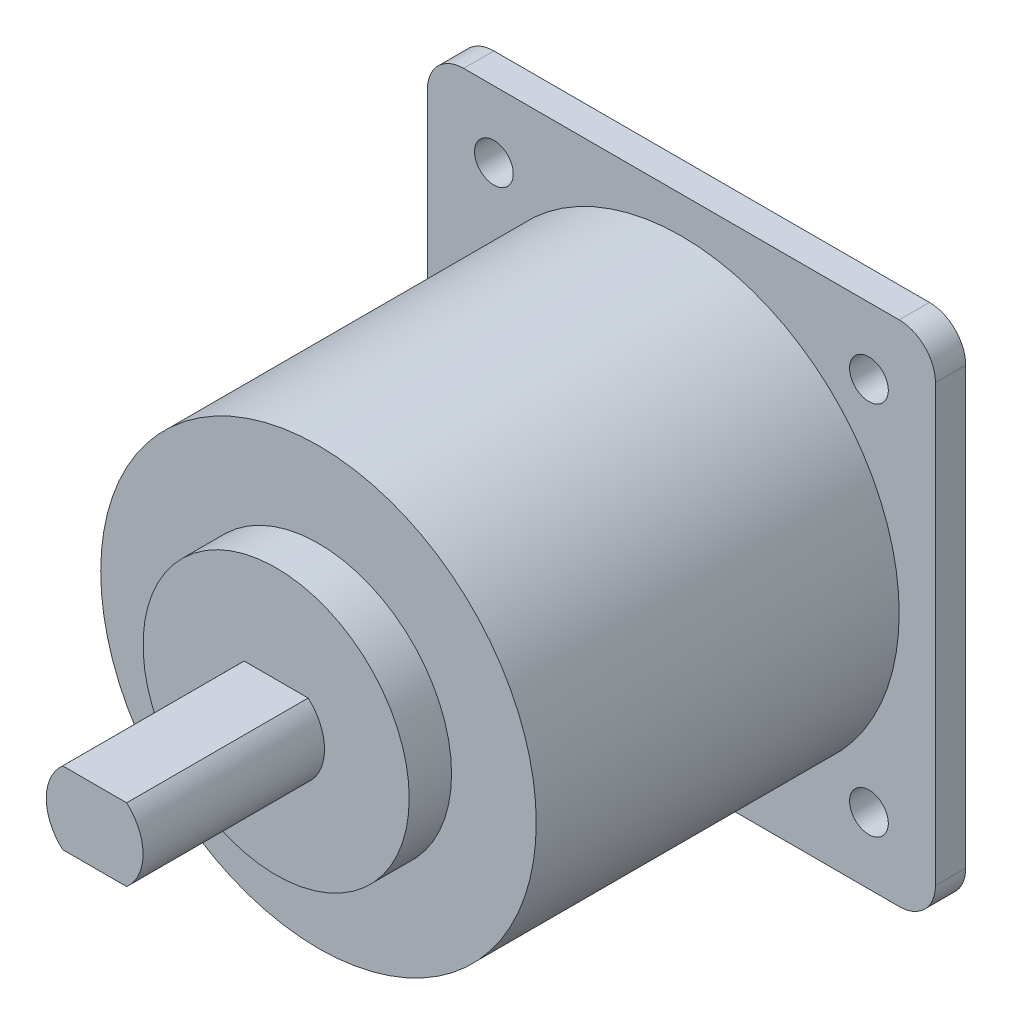
ISO-10303-21;
HEADER;
FILE_DESCRIPTION(('STEP AP214'),'2;1');
FILE_NAME('part.step','',(''),(''),'','','');
FILE_SCHEMA(('AUTOMOTIVE_DESIGN { 1 0 10303 214 1 1 1 1 }'));
ENDSEC;
DATA;
#1=APPLICATION_CONTEXT('core data for automotive mechanical design processes');
#2=APPLICATION_PROTOCOL_DEFINITION('international standard','automotive_design',2000,#1);
#3=PRODUCT_CONTEXT('',#1,'mechanical');
#4=PRODUCT('Part','Part','',(#3));
#5=PRODUCT_RELATED_PRODUCT_CATEGORY('part','',(#4));
#6=PRODUCT_DEFINITION_FORMATION('','',#4);
#7=PRODUCT_DEFINITION_CONTEXT('part definition',#1,'design');
#8=PRODUCT_DEFINITION('design','',#6,#7);
#9=PRODUCT_DEFINITION_SHAPE('','',#8);
#10=(LENGTH_UNIT() NAMED_UNIT(*) SI_UNIT(.MILLI.,.METRE.));
#11=(NAMED_UNIT(*) PLANE_ANGLE_UNIT() SI_UNIT($,.RADIAN.));
#12=(NAMED_UNIT(*) SI_UNIT($,.STERADIAN.) SOLID_ANGLE_UNIT());
#13=UNCERTAINTY_MEASURE_WITH_UNIT(LENGTH_MEASURE(1.E-05),#10,'distance_accuracy_value','');
#14=(GEOMETRIC_REPRESENTATION_CONTEXT(3) GLOBAL_UNCERTAINTY_ASSIGNED_CONTEXT((#13)) GLOBAL_UNIT_ASSIGNED_CONTEXT((#10,
#11,#12)) REPRESENTATION_CONTEXT('',''));
#15=CARTESIAN_POINT('',(0.,0.,0.));
#16=DIRECTION('',(0.,0.,1.));
#17=DIRECTION('',(1.,0.,0.));
#18=AXIS2_PLACEMENT_3D('',#15,#16,#17);
#19=CARTESIAN_POINT('',(0.,0.,32.5));
#20=DIRECTION('',(0.,0.,-1.));
#21=DIRECTION('',(-1.,0.,0.));
#22=AXIS2_PLACEMENT_3D('',#19,#20,#21);
#23=CYLINDRICAL_SURFACE('',#22,18.);
#24=CARTESIAN_POINT('',(0.,0.,32.5));
#25=DIRECTION('',(0.,0.,1.));
#26=DIRECTION('',(1.,0.,0.));
#27=AXIS2_PLACEMENT_3D('',#24,#25,#26);
#28=CIRCLE('',#27,18.);
#29=CARTESIAN_POINT('',(18.,0.,32.5));
#30=VERTEX_POINT('',#29);
#31=EDGE_CURVE('E219',#30,#30,#28,.T.);
#32=ORIENTED_EDGE('',*,*,#31,.F.);
#33=EDGE_LOOP('',(#32));
#34=FACE_BOUND('',#33,.T.);
#35=CARTESIAN_POINT('',(0.,0.,2.5));
#36=DIRECTION('',(0.,0.,-1.));
#37=DIRECTION('',(-1.,0.,0.));
#38=AXIS2_PLACEMENT_3D('',#35,#36,#37);
#39=CIRCLE('',#38,18.);
#40=CARTESIAN_POINT('',(-18.,0.,2.5));
#41=VERTEX_POINT('',#40);
#42=EDGE_CURVE('E237',#41,#41,#39,.T.);
#43=ORIENTED_EDGE('',*,*,#42,.F.);
#44=EDGE_LOOP('',(#43));
#45=FACE_BOUND('',#44,.T.);
#46=ADVANCED_FACE('F45',(#34,#45),#23,.T.);
#47=CARTESIAN_POINT('',(0.,0.,32.5));
#48=DIRECTION('',(0.,0.,1.));
#49=DIRECTION('',(1.,0.,0.));
#50=AXIS2_PLACEMENT_3D('',#47,#48,#49);
#51=PLANE('',#50);
#52=CARTESIAN_POINT('',(0.,0.,32.5));
#53=DIRECTION('',(0.,0.,1.));
#54=DIRECTION('',(1.,0.,0.));
#55=AXIS2_PLACEMENT_3D('',#52,#53,#54);
#56=CIRCLE('',#55,11.);
#57=CARTESIAN_POINT('',(11.,0.,32.5));
#58=VERTEX_POINT('',#57);
#59=EDGE_CURVE('E11',#58,#58,#56,.T.);
#60=ORIENTED_EDGE('',*,*,#59,.F.);
#61=EDGE_LOOP('',(#60));
#62=FACE_BOUND('',#61,.T.);
#63=ORIENTED_EDGE('',*,*,#31,.T.);
#64=EDGE_LOOP('',(#63));
#65=FACE_BOUND('',#64,.T.);
#66=ADVANCED_FACE('F340',(#62,#65),#51,.T.);
#67=CARTESIAN_POINT('',(0.,0.,2.5));
#68=DIRECTION('',(0.,0.,-1.));
#69=DIRECTION('',(-1.,0.,0.));
#70=AXIS2_PLACEMENT_3D('',#67,#68,#69);
#71=PLANE('',#70);
#72=CARTESIAN_POINT('',(15.5,15.5,2.5));
#73=DIRECTION('',(0.,0.,-1.));
#74=DIRECTION('',(-1.,0.,0.));
#75=AXIS2_PLACEMENT_3D('',#72,#73,#74);
#76=CIRCLE('',#75,1.6);
#77=CARTESIAN_POINT('',(13.9,15.5,2.5));
#78=VERTEX_POINT('',#77);
#79=EDGE_CURVE('E183',#78,#78,#76,.T.);
#80=ORIENTED_EDGE('',*,*,#79,.T.);
#81=EDGE_LOOP('',(#80));
#82=FACE_BOUND('',#81,.T.);
#83=CARTESIAN_POINT('',(-15.5,-15.5,2.5));
#84=DIRECTION('',(0.,0.,-1.));
#85=DIRECTION('',(-1.,0.,0.));
#86=AXIS2_PLACEMENT_3D('',#83,#84,#85);
#87=CIRCLE('',#86,1.6);
#88=CARTESIAN_POINT('',(-17.1,-15.5,2.5));
#89=VERTEX_POINT('',#88);
#90=EDGE_CURVE('E174',#89,#89,#87,.T.);
#91=ORIENTED_EDGE('',*,*,#90,.T.);
#92=EDGE_LOOP('',(#91));
#93=FACE_BOUND('',#92,.T.);
#94=CARTESIAN_POINT('',(-15.5,15.5,2.5));
#95=DIRECTION('',(0.,0.,-1.));
#96=DIRECTION('',(-1.,0.,0.));
#97=AXIS2_PLACEMENT_3D('',#94,#95,#96);
#98=CIRCLE('',#97,1.6);
#99=CARTESIAN_POINT('',(-17.1,15.5,2.5));
#100=VERTEX_POINT('',#99);
#101=EDGE_CURVE('E164',#100,#100,#98,.T.);
#102=ORIENTED_EDGE('',*,*,#101,.T.);
#103=EDGE_LOOP('',(#102));
#104=FACE_BOUND('',#103,.T.);
#105=CARTESIAN_POINT('',(15.5,-15.5,2.5));
#106=DIRECTION('',(0.,0.,-1.));
#107=DIRECTION('',(-1.,0.,0.));
#108=AXIS2_PLACEMENT_3D('',#105,#106,#107);
#109=CIRCLE('',#108,1.6);
#110=CARTESIAN_POINT('',(13.9,-15.5,2.5));
#111=VERTEX_POINT('',#110);
#112=EDGE_CURVE('E194',#111,#111,#109,.T.);
#113=ORIENTED_EDGE('',*,*,#112,.T.);
#114=EDGE_LOOP('',(#113));
#115=FACE_BOUND('',#114,.T.);
#116=DIRECTION('',(1.,0.,0.));
#117=VECTOR('',#116,1.);
#118=CARTESIAN_POINT('',(-21.,-21.,2.5));
#119=LINE('',#118,#117);
#120=CARTESIAN_POINT('',(-18.,-21.,2.5));
#121=VERTEX_POINT('',#120);
#122=CARTESIAN_POINT('',(18.,-21.,2.5));
#123=VERTEX_POINT('',#122);
#124=EDGE_CURVE('E215',#121,#123,#119,.T.);
#125=ORIENTED_EDGE('',*,*,#124,.T.);
#126=CARTESIAN_POINT('',(18.,-18.,2.5));
#127=DIRECTION('',(0.,0.,-1.));
#128=DIRECTION('',(-1.,0.,0.));
#129=AXIS2_PLACEMENT_3D('',#126,#127,#128);
#130=CIRCLE('',#129,3.);
#131=CARTESIAN_POINT('',(21.,-18.,2.5));
#132=VERTEX_POINT('',#131);
#133=EDGE_CURVE('E276',#123,#132,#130,.F.);
#134=ORIENTED_EDGE('',*,*,#133,.T.);
#135=DIRECTION('',(0.,1.,0.));
#136=VECTOR('',#135,1.);
#137=CARTESIAN_POINT('',(21.,-21.,2.5));
#138=LINE('',#137,#136);
#139=CARTESIAN_POINT('',(21.,18.,2.5));
#140=VERTEX_POINT('',#139);
#141=EDGE_CURVE('E202',#132,#140,#138,.T.);
#142=ORIENTED_EDGE('',*,*,#141,.T.);
#143=CARTESIAN_POINT('',(18.,18.,2.5));
#144=DIRECTION('',(0.,0.,-1.));
#145=DIRECTION('',(-1.,0.,0.));
#146=AXIS2_PLACEMENT_3D('',#143,#144,#145);
#147=CIRCLE('',#146,3.);
#148=CARTESIAN_POINT('',(18.,21.,2.5));
#149=VERTEX_POINT('',#148);
#150=EDGE_CURVE('E267',#140,#149,#147,.F.);
#151=ORIENTED_EDGE('',*,*,#150,.T.);
#152=DIRECTION('',(-1.,0.,0.));
#153=VECTOR('',#152,1.);
#154=CARTESIAN_POINT('',(-21.,21.,2.5));
#155=LINE('',#154,#153);
#156=CARTESIAN_POINT('',(-18.,21.,2.5));
#157=VERTEX_POINT('',#156);
#158=EDGE_CURVE('E206',#149,#157,#155,.T.);
#159=ORIENTED_EDGE('',*,*,#158,.T.);
#160=CARTESIAN_POINT('',(-18.,18.,2.5));
#161=DIRECTION('',(0.,0.,-1.));
#162=DIRECTION('',(-1.,0.,0.));
#163=AXIS2_PLACEMENT_3D('',#160,#161,#162);
#164=CIRCLE('',#163,3.);
#165=CARTESIAN_POINT('',(-21.,18.,2.5));
#166=VERTEX_POINT('',#165);
#167=EDGE_CURVE('E270',#157,#166,#164,.F.);
#168=ORIENTED_EDGE('',*,*,#167,.T.);
#169=DIRECTION('',(0.,-1.,0.));
#170=VECTOR('',#169,1.);
#171=CARTESIAN_POINT('',(-21.,-21.,2.5));
#172=LINE('',#171,#170);
#173=CARTESIAN_POINT('',(-21.,-18.,2.5));
#174=VERTEX_POINT('',#173);
#175=EDGE_CURVE('E211',#166,#174,#172,.T.);
#176=ORIENTED_EDGE('',*,*,#175,.T.);
#177=CARTESIAN_POINT('',(-18.,-18.,2.5));
#178=DIRECTION('',(0.,0.,-1.));
#179=DIRECTION('',(-1.,0.,0.));
#180=AXIS2_PLACEMENT_3D('',#177,#178,#179);
#181=CIRCLE('',#180,3.);
#182=EDGE_CURVE('E273',#174,#121,#181,.F.);
#183=ORIENTED_EDGE('',*,*,#182,.T.);
#184=EDGE_LOOP('',(#125,#134,#142,#151,#159,#168,#176,#183));
#185=FACE_BOUND('',#184,.T.);
#186=ORIENTED_EDGE('',*,*,#42,.T.);
#187=EDGE_LOOP('',(#186));
#188=FACE_BOUND('',#187,.T.);
#189=ADVANCED_FACE('F298',(#82,#93,#104,#115,#185,#188),#71,.F.);
#190=CARTESIAN_POINT('',(21.,-21.,2.5));
#191=DIRECTION('',(-1.,0.,0.));
#192=DIRECTION('',(0.,0.,1.));
#193=AXIS2_PLACEMENT_3D('',#190,#191,#192);
#194=PLANE('',#193);
#195=ORIENTED_EDGE('',*,*,#141,.F.);
#196=DIRECTION('',(0.,0.,-1.));
#197=VECTOR('',#196,1.);
#198=CARTESIAN_POINT('',(21.,-18.,2.5));
#199=LINE('',#198,#197);
#200=CARTESIAN_POINT('',(21.,-18.,0.));
#201=VERTEX_POINT('',#200);
#202=EDGE_CURVE('E244',#132,#201,#199,.T.);
#203=ORIENTED_EDGE('',*,*,#202,.T.);
#204=DIRECTION('',(0.,1.,0.));
#205=VECTOR('',#204,1.);
#206=CARTESIAN_POINT('',(21.,-21.,0.));
#207=LINE('',#206,#205);
#208=CARTESIAN_POINT('',(21.,18.,0.));
#209=VERTEX_POINT('',#208);
#210=EDGE_CURVE('E198',#201,#209,#207,.T.);
#211=ORIENTED_EDGE('',*,*,#210,.T.);
#212=DIRECTION('',(0.,0.,-1.));
#213=VECTOR('',#212,1.);
#214=CARTESIAN_POINT('',(21.,18.,2.5));
#215=LINE('',#214,#213);
#216=EDGE_CURVE('E241',#209,#140,#215,.F.);
#217=ORIENTED_EDGE('',*,*,#216,.T.);
#218=EDGE_LOOP('',(#195,#203,#211,#217));
#219=FACE_BOUND('',#218,.T.);
#220=ADVANCED_FACE('F326',(#219),#194,.F.);
#221=CARTESIAN_POINT('',(-21.,21.,2.5));
#222=DIRECTION('',(0.,-1.,0.));
#223=DIRECTION('',(0.,0.,-1.));
#224=AXIS2_PLACEMENT_3D('',#221,#222,#223);
#225=PLANE('',#224);
#226=DIRECTION('',(-1.,0.,0.));
#227=VECTOR('',#226,1.);
#228=CARTESIAN_POINT('',(-21.,21.,0.));
#229=LINE('',#228,#227);
#230=CARTESIAN_POINT('',(18.,21.,0.));
#231=VERTEX_POINT('',#230);
#232=CARTESIAN_POINT('',(-18.,21.,0.));
#233=VERTEX_POINT('',#232);
#234=EDGE_CURVE('E223',#231,#233,#229,.T.);
#235=ORIENTED_EDGE('',*,*,#234,.T.);
#236=DIRECTION('',(0.,0.,-1.));
#237=VECTOR('',#236,1.);
#238=CARTESIAN_POINT('',(-18.,21.,2.5));
#239=LINE('',#238,#237);
#240=EDGE_CURVE('E49',#233,#157,#239,.F.);
#241=ORIENTED_EDGE('',*,*,#240,.T.);
#242=ORIENTED_EDGE('',*,*,#158,.F.);
#243=DIRECTION('',(0.,0.,-1.));
#244=VECTOR('',#243,1.);
#245=CARTESIAN_POINT('',(18.,21.,2.5));
#246=LINE('',#245,#244);
#247=EDGE_CURVE('E285',#149,#231,#246,.T.);
#248=ORIENTED_EDGE('',*,*,#247,.T.);
#249=EDGE_LOOP('',(#235,#241,#242,#248));
#250=FACE_BOUND('',#249,.T.);
#251=ADVANCED_FACE('F294',(#250),#225,.F.);
#252=CARTESIAN_POINT('',(-21.,-21.,2.5));
#253=DIRECTION('',(1.,0.,0.));
#254=DIRECTION('',(0.,0.,-1.));
#255=AXIS2_PLACEMENT_3D('',#252,#253,#254);
#256=PLANE('',#255);
#257=DIRECTION('',(0.,-1.,0.));
#258=VECTOR('',#257,1.);
#259=CARTESIAN_POINT('',(-21.,-21.,0.));
#260=LINE('',#259,#258);
#261=CARTESIAN_POINT('',(-21.,18.,0.));
#262=VERTEX_POINT('',#261);
#263=CARTESIAN_POINT('',(-21.,-18.,0.));
#264=VERTEX_POINT('',#263);
#265=EDGE_CURVE('E227',#262,#264,#260,.T.);
#266=ORIENTED_EDGE('',*,*,#265,.T.);
#267=DIRECTION('',(0.,0.,-1.));
#268=VECTOR('',#267,1.);
#269=CARTESIAN_POINT('',(-21.,-18.,2.5));
#270=LINE('',#269,#268);
#271=EDGE_CURVE('E283',#264,#174,#270,.F.);
#272=ORIENTED_EDGE('',*,*,#271,.T.);
#273=ORIENTED_EDGE('',*,*,#175,.F.);
#274=DIRECTION('',(0.,0.,-1.));
#275=VECTOR('',#274,1.);
#276=CARTESIAN_POINT('',(-21.,18.,2.5));
#277=LINE('',#276,#275);
#278=EDGE_CURVE('E279',#166,#262,#277,.T.);
#279=ORIENTED_EDGE('',*,*,#278,.T.);
#280=EDGE_LOOP('',(#266,#272,#273,#279));
#281=FACE_BOUND('',#280,.T.);
#282=ADVANCED_FACE('F306',(#281),#256,.F.);
#283=CARTESIAN_POINT('',(-21.,-21.,2.5));
#284=DIRECTION('',(0.,1.,0.));
#285=DIRECTION('',(0.,0.,1.));
#286=AXIS2_PLACEMENT_3D('',#283,#284,#285);
#287=PLANE('',#286);
#288=DIRECTION('',(1.,0.,0.));
#289=VECTOR('',#288,1.);
#290=CARTESIAN_POINT('',(-21.,-21.,0.));
#291=LINE('',#290,#289);
#292=CARTESIAN_POINT('',(-18.,-21.,0.));
#293=VERTEX_POINT('',#292);
#294=CARTESIAN_POINT('',(18.,-21.,0.));
#295=VERTEX_POINT('',#294);
#296=EDGE_CURVE('E207',#293,#295,#291,.T.);
#297=ORIENTED_EDGE('',*,*,#296,.T.);
#298=DIRECTION('',(0.,0.,-1.));
#299=VECTOR('',#298,1.);
#300=CARTESIAN_POINT('',(18.,-21.,2.5));
#301=LINE('',#300,#299);
#302=EDGE_CURVE('E264',#295,#123,#301,.F.);
#303=ORIENTED_EDGE('',*,*,#302,.T.);
#304=ORIENTED_EDGE('',*,*,#124,.F.);
#305=DIRECTION('',(0.,0.,-1.));
#306=VECTOR('',#305,1.);
#307=CARTESIAN_POINT('',(-18.,-21.,2.5));
#308=LINE('',#307,#306);
#309=EDGE_CURVE('E260',#121,#293,#308,.T.);
#310=ORIENTED_EDGE('',*,*,#309,.T.);
#311=EDGE_LOOP('',(#297,#303,#304,#310));
#312=FACE_BOUND('',#311,.T.);
#313=ADVANCED_FACE('F318',(#312),#287,.F.);
#314=CARTESIAN_POINT('',(0.,0.,0.));
#315=DIRECTION('',(0.,0.,1.));
#316=DIRECTION('',(1.,0.,0.));
#317=AXIS2_PLACEMENT_3D('',#314,#315,#316);
#318=PLANE('',#317);
#319=CARTESIAN_POINT('',(0.,0.,0.));
#320=DIRECTION('',(0.,0.,-1.));
#321=DIRECTION('',(-1.,0.,0.));
#322=AXIS2_PLACEMENT_3D('',#319,#320,#321);
#323=CIRCLE('',#322,11.);
#324=CARTESIAN_POINT('',(-11.,0.,0.));
#325=VERTEX_POINT('',#324);
#326=EDGE_CURVE('E560',#325,#325,#323,.T.);
#327=ORIENTED_EDGE('',*,*,#326,.F.);
#328=EDGE_LOOP('',(#327));
#329=FACE_BOUND('',#328,.T.);
#330=CARTESIAN_POINT('',(15.5,15.5,0.));
#331=DIRECTION('',(0.,0.,-1.));
#332=DIRECTION('',(-1.,0.,0.));
#333=AXIS2_PLACEMENT_3D('',#330,#331,#332);
#334=CIRCLE('',#333,1.6);
#335=CARTESIAN_POINT('',(13.9,15.5,0.));
#336=VERTEX_POINT('',#335);
#337=EDGE_CURVE('E178',#336,#336,#334,.T.);
#338=ORIENTED_EDGE('',*,*,#337,.F.);
#339=EDGE_LOOP('',(#338));
#340=FACE_BOUND('',#339,.T.);
#341=CARTESIAN_POINT('',(-15.5,-15.5,0.));
#342=DIRECTION('',(0.,0.,-1.));
#343=DIRECTION('',(-1.,0.,0.));
#344=AXIS2_PLACEMENT_3D('',#341,#342,#343);
#345=CIRCLE('',#344,1.6);
#346=CARTESIAN_POINT('',(-17.1,-15.5,0.));
#347=VERTEX_POINT('',#346);
#348=EDGE_CURVE('E187',#347,#347,#345,.T.);
#349=ORIENTED_EDGE('',*,*,#348,.F.);
#350=EDGE_LOOP('',(#349));
#351=FACE_BOUND('',#350,.T.);
#352=CARTESIAN_POINT('',(-15.5,15.5,0.));
#353=DIRECTION('',(0.,0.,-1.));
#354=DIRECTION('',(-1.,0.,0.));
#355=AXIS2_PLACEMENT_3D('',#352,#353,#354);
#356=CIRCLE('',#355,1.6);
#357=CARTESIAN_POINT('',(-17.1,15.5,0.));
#358=VERTEX_POINT('',#357);
#359=EDGE_CURVE('E170',#358,#358,#356,.T.);
#360=ORIENTED_EDGE('',*,*,#359,.F.);
#361=EDGE_LOOP('',(#360));
#362=FACE_BOUND('',#361,.T.);
#363=CARTESIAN_POINT('',(15.5,-15.5,0.));
#364=DIRECTION('',(0.,0.,-1.));
#365=DIRECTION('',(-1.,0.,0.));
#366=AXIS2_PLACEMENT_3D('',#363,#364,#365);
#367=CIRCLE('',#366,1.6);
#368=CARTESIAN_POINT('',(13.9,-15.5,0.));
#369=VERTEX_POINT('',#368);
#370=EDGE_CURVE('E182',#369,#369,#367,.T.);
#371=ORIENTED_EDGE('',*,*,#370,.F.);
#372=EDGE_LOOP('',(#371));
#373=FACE_BOUND('',#372,.T.);
#374=ORIENTED_EDGE('',*,*,#210,.F.);
#375=CARTESIAN_POINT('',(18.,-18.,0.));
#376=DIRECTION('',(0.,0.,1.));
#377=DIRECTION('',(1.,0.,0.));
#378=AXIS2_PLACEMENT_3D('',#375,#376,#377);
#379=CIRCLE('',#378,3.);
#380=EDGE_CURVE('E257',#201,#295,#379,.F.);
#381=ORIENTED_EDGE('',*,*,#380,.T.);
#382=ORIENTED_EDGE('',*,*,#296,.F.);
#383=CARTESIAN_POINT('',(-18.,-18.,0.));
#384=DIRECTION('',(0.,0.,1.));
#385=DIRECTION('',(1.,0.,0.));
#386=AXIS2_PLACEMENT_3D('',#383,#384,#385);
#387=CIRCLE('',#386,3.);
#388=EDGE_CURVE('E254',#293,#264,#387,.F.);
#389=ORIENTED_EDGE('',*,*,#388,.T.);
#390=ORIENTED_EDGE('',*,*,#265,.F.);
#391=CARTESIAN_POINT('',(-18.,18.,0.));
#392=DIRECTION('',(0.,0.,1.));
#393=DIRECTION('',(1.,0.,0.));
#394=AXIS2_PLACEMENT_3D('',#391,#392,#393);
#395=CIRCLE('',#394,3.);
#396=EDGE_CURVE('E251',#262,#233,#395,.F.);
#397=ORIENTED_EDGE('',*,*,#396,.T.);
#398=ORIENTED_EDGE('',*,*,#234,.F.);
#399=CARTESIAN_POINT('',(18.,18.,0.));
#400=DIRECTION('',(0.,0.,1.));
#401=DIRECTION('',(1.,0.,0.));
#402=AXIS2_PLACEMENT_3D('',#399,#400,#401);
#403=CIRCLE('',#402,3.);
#404=EDGE_CURVE('E248',#231,#209,#403,.F.);
#405=ORIENTED_EDGE('',*,*,#404,.T.);
#406=EDGE_LOOP('',(#374,#381,#382,#389,#390,#397,#398,#405));
#407=FACE_BOUND('',#406,.T.);
#408=ADVANCED_FACE('F310',(#329,#340,#351,#362,#373,#407),#318,.F.);
#409=CARTESIAN_POINT('',(18.,-18.,2.5));
#410=DIRECTION('',(0.,0.,-1.));
#411=DIRECTION('',(-1.,0.,0.));
#412=AXIS2_PLACEMENT_3D('',#409,#410,#411);
#413=CYLINDRICAL_SURFACE('',#412,3.);
#414=ORIENTED_EDGE('',*,*,#133,.F.);
#415=ORIENTED_EDGE('',*,*,#302,.F.);
#416=ORIENTED_EDGE('',*,*,#380,.F.);
#417=ORIENTED_EDGE('',*,*,#202,.F.);
#418=EDGE_LOOP('',(#414,#415,#416,#417));
#419=FACE_BOUND('',#418,.T.);
#420=ADVANCED_FACE('F324',(#419),#413,.T.);
#421=CARTESIAN_POINT('',(-18.,-18.,2.5));
#422=DIRECTION('',(0.,0.,-1.));
#423=DIRECTION('',(-1.,0.,0.));
#424=AXIS2_PLACEMENT_3D('',#421,#422,#423);
#425=CYLINDRICAL_SURFACE('',#424,3.);
#426=ORIENTED_EDGE('',*,*,#182,.F.);
#427=ORIENTED_EDGE('',*,*,#271,.F.);
#428=ORIENTED_EDGE('',*,*,#388,.F.);
#429=ORIENTED_EDGE('',*,*,#309,.F.);
#430=EDGE_LOOP('',(#426,#427,#428,#429));
#431=FACE_BOUND('',#430,.T.);
#432=ADVANCED_FACE('F315',(#431),#425,.T.);
#433=CARTESIAN_POINT('',(-18.,18.,2.5));
#434=DIRECTION('',(0.,0.,-1.));
#435=DIRECTION('',(-1.,0.,0.));
#436=AXIS2_PLACEMENT_3D('',#433,#434,#435);
#437=CYLINDRICAL_SURFACE('',#436,3.);
#438=ORIENTED_EDGE('',*,*,#167,.F.);
#439=ORIENTED_EDGE('',*,*,#240,.F.);
#440=ORIENTED_EDGE('',*,*,#396,.F.);
#441=ORIENTED_EDGE('',*,*,#278,.F.);
#442=EDGE_LOOP('',(#438,#439,#440,#441));
#443=FACE_BOUND('',#442,.T.);
#444=ADVANCED_FACE('F303',(#443),#437,.T.);
#445=CARTESIAN_POINT('',(18.,18.,2.5));
#446=DIRECTION('',(0.,0.,-1.));
#447=DIRECTION('',(-1.,0.,0.));
#448=AXIS2_PLACEMENT_3D('',#445,#446,#447);
#449=CYLINDRICAL_SURFACE('',#448,3.);
#450=ORIENTED_EDGE('',*,*,#150,.F.);
#451=ORIENTED_EDGE('',*,*,#216,.F.);
#452=ORIENTED_EDGE('',*,*,#404,.F.);
#453=ORIENTED_EDGE('',*,*,#247,.F.);
#454=EDGE_LOOP('',(#450,#451,#452,#453));
#455=FACE_BOUND('',#454,.T.);
#456=ADVANCED_FACE('F47',(#455),#449,.T.);
#457=CARTESIAN_POINT('',(15.5,-15.5,2.5));
#458=DIRECTION('',(0.,0.,-1.));
#459=DIRECTION('',(-1.,0.,0.));
#460=AXIS2_PLACEMENT_3D('',#457,#458,#459);
#461=CYLINDRICAL_SURFACE('',#460,1.6);
#462=ORIENTED_EDGE('',*,*,#112,.F.);
#463=EDGE_LOOP('',(#462));
#464=FACE_BOUND('',#463,.T.);
#465=ORIENTED_EDGE('',*,*,#370,.T.);
#466=EDGE_LOOP('',(#465));
#467=FACE_BOUND('',#466,.T.);
#468=ADVANCED_FACE('F330',(#464,#467),#461,.F.);
#469=CARTESIAN_POINT('',(-15.5,15.5,2.5));
#470=DIRECTION('',(0.,0.,-1.));
#471=DIRECTION('',(-1.,0.,0.));
#472=AXIS2_PLACEMENT_3D('',#469,#470,#471);
#473=CYLINDRICAL_SURFACE('',#472,1.6);
#474=ORIENTED_EDGE('',*,*,#101,.F.);
#475=EDGE_LOOP('',(#474));
#476=FACE_BOUND('',#475,.T.);
#477=ORIENTED_EDGE('',*,*,#359,.T.);
#478=EDGE_LOOP('',(#477));
#479=FACE_BOUND('',#478,.T.);
#480=ADVANCED_FACE('F336',(#476,#479),#473,.F.);
#481=CARTESIAN_POINT('',(-15.5,-15.5,2.5));
#482=DIRECTION('',(0.,0.,-1.));
#483=DIRECTION('',(-1.,0.,0.));
#484=AXIS2_PLACEMENT_3D('',#481,#482,#483);
#485=CYLINDRICAL_SURFACE('',#484,1.6);
#486=ORIENTED_EDGE('',*,*,#90,.F.);
#487=EDGE_LOOP('',(#486));
#488=FACE_BOUND('',#487,.T.);
#489=ORIENTED_EDGE('',*,*,#348,.T.);
#490=EDGE_LOOP('',(#489));
#491=FACE_BOUND('',#490,.T.);
#492=ADVANCED_FACE('F386',(#488,#491),#485,.F.);
#493=CARTESIAN_POINT('',(15.5,15.5,2.5));
#494=DIRECTION('',(0.,0.,-1.));
#495=DIRECTION('',(-1.,0.,0.));
#496=AXIS2_PLACEMENT_3D('',#493,#494,#495);
#497=CYLINDRICAL_SURFACE('',#496,1.6);
#498=ORIENTED_EDGE('',*,*,#79,.F.);
#499=EDGE_LOOP('',(#498));
#500=FACE_BOUND('',#499,.T.);
#501=ORIENTED_EDGE('',*,*,#337,.T.);
#502=EDGE_LOOP('',(#501));
#503=FACE_BOUND('',#502,.T.);
#504=ADVANCED_FACE('F396',(#500,#503),#497,.F.);
#505=CARTESIAN_POINT('',(0.,0.,36.));
#506=DIRECTION('',(0.,0.,-1.));
#507=DIRECTION('',(-1.,0.,0.));
#508=AXIS2_PLACEMENT_3D('',#505,#506,#507);
#509=CYLINDRICAL_SURFACE('',#508,11.);
#510=CARTESIAN_POINT('',(0.,0.,36.));
#511=DIRECTION('',(0.,0.,1.));
#512=DIRECTION('',(1.,0.,0.));
#513=AXIS2_PLACEMENT_3D('',#510,#511,#512);
#514=CIRCLE('',#513,11.);
#515=CARTESIAN_POINT('',(11.,0.,36.));
#516=VERTEX_POINT('',#515);
#517=EDGE_CURVE('E159',#516,#516,#514,.T.);
#518=ORIENTED_EDGE('',*,*,#517,.F.);
#519=EDGE_LOOP('',(#518));
#520=FACE_BOUND('',#519,.T.);
#521=ORIENTED_EDGE('',*,*,#59,.T.);
#522=EDGE_LOOP('',(#521));
#523=FACE_BOUND('',#522,.T.);
#524=ADVANCED_FACE('F406',(#520,#523),#509,.T.);
#525=CARTESIAN_POINT('',(0.,0.,36.));
#526=DIRECTION('',(0.,0.,1.));
#527=DIRECTION('',(1.,0.,0.));
#528=AXIS2_PLACEMENT_3D('',#525,#526,#527);
#529=PLANE('',#528);
#530=CARTESIAN_POINT('',(0.,0.,36.));
#531=DIRECTION('',(0.,0.,1.));
#532=DIRECTION('',(1.,0.,0.));
#533=AXIS2_PLACEMENT_3D('',#530,#531,#532);
#534=CIRCLE('',#533,4.);
#535=CARTESIAN_POINT('',(-2.64575131106459,3.,36.));
#536=VERTEX_POINT('',#535);
#537=CARTESIAN_POINT('',(-2.64575131106459,-3.,36.));
#538=VERTEX_POINT('',#537);
#539=EDGE_CURVE('E62',#536,#538,#534,.T.);
#540=ORIENTED_EDGE('',*,*,#539,.F.);
#541=DIRECTION('',(-1.,0.,0.));
#542=VECTOR('',#541,1.);
#543=CARTESIAN_POINT('',(-2.64575131106459,3.,36.));
#544=LINE('',#543,#542);
#545=CARTESIAN_POINT('',(2.64575131106459,3.,36.));
#546=VERTEX_POINT('',#545);
#547=EDGE_CURVE('E66',#546,#536,#544,.T.);
#548=ORIENTED_EDGE('',*,*,#547,.F.);
#549=CARTESIAN_POINT('',(0.,0.,36.));
#550=DIRECTION('',(0.,0.,1.));
#551=DIRECTION('',(-1.,0.,0.));
#552=AXIS2_PLACEMENT_3D('',#549,#550,#551);
#553=CIRCLE('',#552,4.);
#554=CARTESIAN_POINT('',(2.64575131106459,-3.,36.));
#555=VERTEX_POINT('',#554);
#556=EDGE_CURVE('E589',#555,#546,#553,.T.);
#557=ORIENTED_EDGE('',*,*,#556,.F.);
#558=DIRECTION('',(1.,0.,0.));
#559=VECTOR('',#558,1.);
#560=CARTESIAN_POINT('',(-2.64575131106459,-3.,36.));
#561=LINE('',#560,#559);
#562=EDGE_CURVE('E586',#538,#555,#561,.T.);
#563=ORIENTED_EDGE('',*,*,#562,.F.);
#564=EDGE_LOOP('',(#540,#548,#557,#563));
#565=FACE_BOUND('',#564,.T.);
#566=ORIENTED_EDGE('',*,*,#517,.T.);
#567=EDGE_LOOP('',(#566));
#568=FACE_BOUND('',#567,.T.);
#569=ADVANCED_FACE('F416',(#565,#568),#529,.T.);
#570=CARTESIAN_POINT('',(0.,0.,51.));
#571=DIRECTION('',(0.,0.,-1.));
#572=DIRECTION('',(-1.,0.,0.));
#573=AXIS2_PLACEMENT_3D('',#570,#571,#572);
#574=CYLINDRICAL_SURFACE('',#573,4.);
#575=ORIENTED_EDGE('',*,*,#539,.T.);
#576=DIRECTION('',(0.,0.,-1.));
#577=VECTOR('',#576,1.);
#578=CARTESIAN_POINT('',(-2.64575131106459,-3.,51.));
#579=LINE('',#578,#577);
#580=CARTESIAN_POINT('',(-2.64575131106459,-3.,51.));
#581=VERTEX_POINT('',#580);
#582=EDGE_CURVE('E139',#581,#538,#579,.T.);
#583=ORIENTED_EDGE('',*,*,#582,.F.);
#584=CARTESIAN_POINT('',(0.,0.,51.));
#585=DIRECTION('',(0.,0.,1.));
#586=DIRECTION('',(1.,0.,0.));
#587=AXIS2_PLACEMENT_3D('',#584,#585,#586);
#588=CIRCLE('',#587,4.);
#589=CARTESIAN_POINT('',(-2.64575131106459,3.,51.));
#590=VERTEX_POINT('',#589);
#591=EDGE_CURVE('E146',#590,#581,#588,.T.);
#592=ORIENTED_EDGE('',*,*,#591,.F.);
#593=DIRECTION('',(0.,0.,-1.));
#594=VECTOR('',#593,1.);
#595=CARTESIAN_POINT('',(-2.64575131106459,3.,51.));
#596=LINE('',#595,#594);
#597=EDGE_CURVE('E583',#590,#536,#596,.T.);
#598=ORIENTED_EDGE('',*,*,#597,.T.);
#599=EDGE_LOOP('',(#575,#583,#592,#598));
#600=FACE_BOUND('',#599,.T.);
#601=ADVANCED_FACE('F157',(#600),#574,.T.);
#602=CARTESIAN_POINT('',(-2.64575131106459,-3.,51.));
#603=DIRECTION('',(0.,1.,0.));
#604=DIRECTION('',(-1.,0.,0.));
#605=AXIS2_PLACEMENT_3D('',#602,#603,#604);
#606=PLANE('',#605);
#607=ORIENTED_EDGE('',*,*,#562,.T.);
#608=DIRECTION('',(0.,0.,-1.));
#609=VECTOR('',#608,1.);
#610=CARTESIAN_POINT('',(2.64575131106459,-3.,51.));
#611=LINE('',#610,#609);
#612=CARTESIAN_POINT('',(2.64575131106459,-3.,51.));
#613=VERTEX_POINT('',#612);
#614=EDGE_CURVE('E141',#613,#555,#611,.T.);
#615=ORIENTED_EDGE('',*,*,#614,.F.);
#616=DIRECTION('',(1.,0.,0.));
#617=VECTOR('',#616,1.);
#618=CARTESIAN_POINT('',(-2.64575131106459,-3.,51.));
#619=LINE('',#618,#617);
#620=EDGE_CURVE('E134',#581,#613,#619,.T.);
#621=ORIENTED_EDGE('',*,*,#620,.F.);
#622=ORIENTED_EDGE('',*,*,#582,.T.);
#623=EDGE_LOOP('',(#607,#615,#621,#622));
#624=FACE_BOUND('',#623,.T.);
#625=ADVANCED_FACE('F137',(#624),#606,.F.);
#626=CARTESIAN_POINT('',(0.,0.,51.));
#627=DIRECTION('',(0.,0.,-1.));
#628=DIRECTION('',(-1.,0.,0.));
#629=AXIS2_PLACEMENT_3D('',#626,#627,#628);
#630=CYLINDRICAL_SURFACE('',#629,4.);
#631=ORIENTED_EDGE('',*,*,#556,.T.);
#632=DIRECTION('',(0.,0.,-1.));
#633=VECTOR('',#632,1.);
#634=CARTESIAN_POINT('',(2.64575131106459,3.,51.));
#635=LINE('',#634,#633);
#636=CARTESIAN_POINT('',(2.64575131106459,3.,51.));
#637=VERTEX_POINT('',#636);
#638=EDGE_CURVE('E166',#637,#546,#635,.T.);
#639=ORIENTED_EDGE('',*,*,#638,.F.);
#640=CARTESIAN_POINT('',(0.,0.,51.));
#641=DIRECTION('',(0.,0.,1.));
#642=DIRECTION('',(-1.,0.,0.));
#643=AXIS2_PLACEMENT_3D('',#640,#641,#642);
#644=CIRCLE('',#643,4.);
#645=EDGE_CURVE('E145',#613,#637,#644,.T.);
#646=ORIENTED_EDGE('',*,*,#645,.F.);
#647=ORIENTED_EDGE('',*,*,#614,.T.);
#648=EDGE_LOOP('',(#631,#639,#646,#647));
#649=FACE_BOUND('',#648,.T.);
#650=ADVANCED_FACE('F442',(#649),#630,.T.);
#651=CARTESIAN_POINT('',(-2.64575131106459,3.,51.));
#652=DIRECTION('',(0.,-1.,0.));
#653=DIRECTION('',(0.,0.,-1.));
#654=AXIS2_PLACEMENT_3D('',#651,#652,#653);
#655=PLANE('',#654);
#656=ORIENTED_EDGE('',*,*,#547,.T.);
#657=ORIENTED_EDGE('',*,*,#597,.F.);
#658=DIRECTION('',(-1.,0.,0.));
#659=VECTOR('',#658,1.);
#660=CARTESIAN_POINT('',(-2.64575131106459,3.,51.));
#661=LINE('',#660,#659);
#662=EDGE_CURVE('E151',#637,#590,#661,.T.);
#663=ORIENTED_EDGE('',*,*,#662,.F.);
#664=ORIENTED_EDGE('',*,*,#638,.T.);
#665=EDGE_LOOP('',(#656,#657,#663,#664));
#666=FACE_BOUND('',#665,.T.);
#667=ADVANCED_FACE('F451',(#666),#655,.F.);
#668=CARTESIAN_POINT('',(0.,0.,51.));
#669=DIRECTION('',(0.,0.,1.));
#670=DIRECTION('',(1.,0.,0.));
#671=AXIS2_PLACEMENT_3D('',#668,#669,#670);
#672=PLANE('',#671);
#673=ORIENTED_EDGE('',*,*,#591,.T.);
#674=ORIENTED_EDGE('',*,*,#620,.T.);
#675=ORIENTED_EDGE('',*,*,#645,.T.);
#676=ORIENTED_EDGE('',*,*,#662,.T.);
#677=EDGE_LOOP('',(#673,#674,#675,#676));
#678=FACE_BOUND('',#677,.T.);
#679=ADVANCED_FACE('F149',(#678),#672,.T.);
#680=CARTESIAN_POINT('',(0.,0.,25.));
#681=DIRECTION('',(0.,0.,-1.));
#682=DIRECTION('',(-1.,0.,0.));
#683=AXIS2_PLACEMENT_3D('',#680,#681,#682);
#684=CYLINDRICAL_SURFACE('',#683,11.);
#685=CARTESIAN_POINT('',(0.,0.,25.));
#686=DIRECTION('',(0.,0.,-1.));
#687=DIRECTION('',(-1.,0.,0.));
#688=AXIS2_PLACEMENT_3D('',#685,#686,#687);
#689=CIRCLE('',#688,11.);
#690=CARTESIAN_POINT('',(-11.,0.,25.));
#691=VERTEX_POINT('',#690);
#692=EDGE_CURVE('E574',#691,#691,#689,.T.);
#693=ORIENTED_EDGE('',*,*,#692,.F.);
#694=EDGE_LOOP('',(#693));
#695=FACE_BOUND('',#694,.T.);
#696=ORIENTED_EDGE('',*,*,#326,.T.);
#697=EDGE_LOOP('',(#696));
#698=FACE_BOUND('',#697,.T.);
#699=ADVANCED_FACE('F470',(#695,#698),#684,.F.);
#700=CARTESIAN_POINT('',(0.,0.,25.));
#701=DIRECTION('',(0.,0.,-1.));
#702=DIRECTION('',(-1.,0.,0.));
#703=AXIS2_PLACEMENT_3D('',#700,#701,#702);
#704=PLANE('',#703);
#705=ORIENTED_EDGE('',*,*,#692,.T.);
#706=EDGE_LOOP('',(#705));
#707=FACE_BOUND('',#706,.T.);
#708=ADVANCED_FACE('F480',(#707),#704,.T.);
#709=CLOSED_SHELL('',(#46,#66,#189,#220,#251,#282,#313,#408,#420,#432,#444,#456,#468,#480,#492,
#504,#524,#569,#601,#625,#650,#667,#679,#699,#708));
#710=MANIFOLD_SOLID_BREP('B2',#709);
#711=ADVANCED_BREP_SHAPE_REPRESENTATION('',(#18,#710),#14);
#712=SHAPE_DEFINITION_REPRESENTATION(#9,#711);
ENDSEC;
END-ISO-10303-21;
